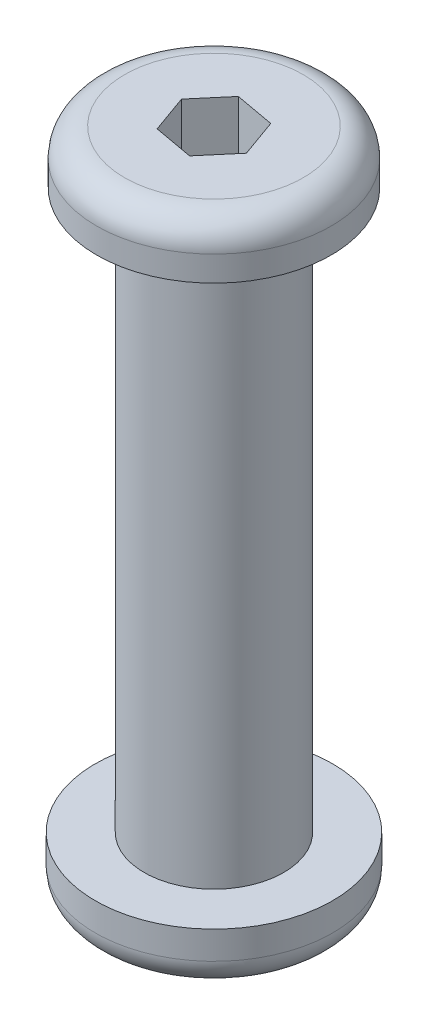
ISO-10303-21;
HEADER;
FILE_DESCRIPTION(('STEP AP214'),'2;1');
FILE_NAME('part.step','',(''),(''),'','','');
FILE_SCHEMA(('AUTOMOTIVE_DESIGN { 1 0 10303 214 1 1 1 1 }'));
ENDSEC;
DATA;
#1=APPLICATION_CONTEXT('core data for automotive mechanical design processes');
#2=APPLICATION_PROTOCOL_DEFINITION('international standard','automotive_design',2000,#1);
#3=PRODUCT_CONTEXT('',#1,'mechanical');
#4=PRODUCT('Part','Part','',(#3));
#5=PRODUCT_RELATED_PRODUCT_CATEGORY('part','',(#4));
#6=PRODUCT_DEFINITION_FORMATION('','',#4);
#7=PRODUCT_DEFINITION_CONTEXT('part definition',#1,'design');
#8=PRODUCT_DEFINITION('design','',#6,#7);
#9=PRODUCT_DEFINITION_SHAPE('','',#8);
#10=(LENGTH_UNIT() NAMED_UNIT(*) SI_UNIT(.MILLI.,.METRE.));
#11=(NAMED_UNIT(*) PLANE_ANGLE_UNIT() SI_UNIT($,.RADIAN.));
#12=(NAMED_UNIT(*) SI_UNIT($,.STERADIAN.) SOLID_ANGLE_UNIT());
#13=UNCERTAINTY_MEASURE_WITH_UNIT(LENGTH_MEASURE(1.E-05),#10,'distance_accuracy_value','');
#14=(GEOMETRIC_REPRESENTATION_CONTEXT(3) GLOBAL_UNCERTAINTY_ASSIGNED_CONTEXT((#13)) GLOBAL_UNIT_ASSIGNED_CONTEXT((#10,
#11,#12)) REPRESENTATION_CONTEXT('',''));
#15=CARTESIAN_POINT('',(0.,0.,0.));
#16=DIRECTION('',(0.,0.,1.));
#17=DIRECTION('',(1.,0.,0.));
#18=AXIS2_PLACEMENT_3D('',#15,#16,#17);
#19=CARTESIAN_POINT('',(0.,20.,0.));
#20=DIRECTION('',(0.,-1.,0.));
#21=DIRECTION('',(0.,0.,-1.));
#22=AXIS2_PLACEMENT_3D('',#19,#20,#21);
#23=CYLINDRICAL_SURFACE('',#22,2.5);
#24=CARTESIAN_POINT('',(0.,20.,0.));
#25=DIRECTION('',(0.,1.,0.));
#26=DIRECTION('',(0.,0.,1.));
#27=AXIS2_PLACEMENT_3D('',#24,#25,#26);
#28=CIRCLE('',#27,2.5);
#29=CARTESIAN_POINT('',(0.,20.,2.5));
#30=VERTEX_POINT('',#29);
#31=EDGE_CURVE('E236',#30,#30,#28,.T.);
#32=ORIENTED_EDGE('',*,*,#31,.F.);
#33=EDGE_LOOP('',(#32));
#34=FACE_BOUND('',#33,.T.);
#35=CARTESIAN_POINT('',(0.,0.,0.));
#36=DIRECTION('',(0.,-1.,0.));
#37=DIRECTION('',(0.,0.,-1.));
#38=AXIS2_PLACEMENT_3D('',#35,#36,#37);
#39=CIRCLE('',#38,2.5);
#40=CARTESIAN_POINT('',(0.,0.,-2.5));
#41=VERTEX_POINT('',#40);
#42=EDGE_CURVE('E188',#41,#41,#39,.T.);
#43=ORIENTED_EDGE('',*,*,#42,.F.);
#44=EDGE_LOOP('',(#43));
#45=FACE_BOUND('',#44,.T.);
#46=ADVANCED_FACE('F41',(#34,#45),#23,.T.);
#47=CARTESIAN_POINT('',(0.,21.9,0.));
#48=DIRECTION('',(0.,1.,0.));
#49=DIRECTION('',(0.,0.,1.));
#50=AXIS2_PLACEMENT_3D('',#47,#48,#49);
#51=PLANE('',#50);
#52=CARTESIAN_POINT('',(0.,21.9,0.));
#53=DIRECTION('',(0.,1.,0.));
#54=DIRECTION('',(0.,0.,1.));
#55=AXIS2_PLACEMENT_3D('',#52,#53,#54);
#56=CIRCLE('',#55,3.2);
#57=CARTESIAN_POINT('',(0.,21.9,3.2));
#58=VERTEX_POINT('',#57);
#59=EDGE_CURVE('E239',#58,#58,#56,.T.);
#60=ORIENTED_EDGE('',*,*,#59,.T.);
#61=EDGE_LOOP('',(#60));
#62=FACE_BOUND('',#61,.T.);
#63=DIRECTION('',(-0.983890145469255,0.,-0.178774107880554));
#64=VECTOR('',#63,1.);
#65=CARTESIAN_POINT('',(0.933529185275309,21.9,-1.10084358270035));
#66=LINE('',#65,#64);
#67=CARTESIAN_POINT('',(0.933529185275309,21.9,-1.10084358270035));
#68=VERTEX_POINT('',#67);
#69=CARTESIAN_POINT('',(-0.486593915573927,21.9,-1.35888178097279));
#70=VERTEX_POINT('',#69);
#71=EDGE_CURVE('E193',#68,#70,#66,.T.);
#72=ORIENTED_EDGE('',*,*,#71,.F.);
#73=DIRECTION('',(-0.337122153771169,0.,-0.941460914449818));
#74=VECTOR('',#73,1.);
#75=CARTESIAN_POINT('',(1.42012310084924,21.9,0.258038198272432));
#76=LINE('',#75,#74);
#77=CARTESIAN_POINT('',(1.42012310084924,21.9,0.258038198272432));
#78=VERTEX_POINT('',#77);
#79=EDGE_CURVE('E191',#78,#68,#76,.T.);
#80=ORIENTED_EDGE('',*,*,#79,.F.);
#81=DIRECTION('',(0.646767991698087,0.,-0.762686806569265));
#82=VECTOR('',#81,1.);
#83=CARTESIAN_POINT('',(0.486593915573928,21.9,1.35888178097278));
#84=LINE('',#83,#82);
#85=CARTESIAN_POINT('',(0.486593915573928,21.9,1.35888178097278));
#86=VERTEX_POINT('',#85);
#87=EDGE_CURVE('E203',#86,#78,#84,.T.);
#88=ORIENTED_EDGE('',*,*,#87,.F.);
#89=DIRECTION('',(0.983890145469255,0.,0.178774107880553));
#90=VECTOR('',#89,1.);
#91=CARTESIAN_POINT('',(-0.933529185275311,21.9,1.10084358270035));
#92=LINE('',#91,#90);
#93=CARTESIAN_POINT('',(-0.933529185275311,21.9,1.10084358270035));
#94=VERTEX_POINT('',#93);
#95=EDGE_CURVE('E200',#94,#86,#92,.T.);
#96=ORIENTED_EDGE('',*,*,#95,.F.);
#97=DIRECTION('',(0.337122153771169,0.,0.941460914449818));
#98=VECTOR('',#97,1.);
#99=CARTESIAN_POINT('',(-1.42012310084924,21.9,-0.258038198272431));
#100=LINE('',#99,#98);
#101=CARTESIAN_POINT('',(-1.42012310084924,21.9,-0.258038198272431));
#102=VERTEX_POINT('',#101);
#103=EDGE_CURVE('E198',#102,#94,#100,.T.);
#104=ORIENTED_EDGE('',*,*,#103,.F.);
#105=DIRECTION('',(-0.646767991698087,0.,0.762686806569266));
#106=VECTOR('',#105,1.);
#107=CARTESIAN_POINT('',(-0.486593915573927,21.9,-1.35888178097279));
#108=LINE('',#107,#106);
#109=EDGE_CURVE('E196',#70,#102,#108,.T.);
#110=ORIENTED_EDGE('',*,*,#109,.F.);
#111=EDGE_LOOP('',(#72,#80,#88,#96,#104,#110));
#112=FACE_BOUND('',#111,.T.);
#113=ADVANCED_FACE('F258',(#62,#112),#51,.T.);
#114=CARTESIAN_POINT('',(0.,20.,0.));
#115=DIRECTION('',(0.,1.,0.));
#116=DIRECTION('',(0.,0.,1.));
#117=AXIS2_PLACEMENT_3D('',#114,#115,#116);
#118=PLANE('',#117);
#119=ORIENTED_EDGE('',*,*,#31,.T.);
#120=EDGE_LOOP('',(#119));
#121=FACE_BOUND('',#120,.T.);
#122=CARTESIAN_POINT('',(0.,20.,0.));
#123=DIRECTION('',(0.,1.,0.));
#124=DIRECTION('',(0.,0.,1.));
#125=AXIS2_PLACEMENT_3D('',#122,#123,#124);
#126=CIRCLE('',#125,4.2);
#127=CARTESIAN_POINT('',(0.,20.,-4.2));
#128=VERTEX_POINT('',#127);
#129=EDGE_CURVE('E233',#128,#128,#126,.T.);
#130=ORIENTED_EDGE('',*,*,#129,.F.);
#131=EDGE_LOOP('',(#130));
#132=FACE_BOUND('',#131,.T.);
#133=ADVANCED_FACE('F265',(#121,#132),#118,.F.);
#134=CARTESIAN_POINT('',(0.,21.9,0.));
#135=DIRECTION('',(0.,-1.,0.));
#136=DIRECTION('',(0.,0.,-1.));
#137=AXIS2_PLACEMENT_3D('',#134,#135,#136);
#138=CYLINDRICAL_SURFACE('',#137,4.2);
#139=CARTESIAN_POINT('',(0.,20.9,0.));
#140=DIRECTION('',(0.,1.,0.));
#141=DIRECTION('',(0.,0.,1.));
#142=AXIS2_PLACEMENT_3D('',#139,#140,#141);
#143=CIRCLE('',#142,4.2);
#144=CARTESIAN_POINT('',(0.,20.9,-4.2));
#145=VERTEX_POINT('',#144);
#146=EDGE_CURVE('E242',#145,#145,#143,.F.);
#147=CARTESIAN_POINT('',(0.,20.9,-4.2));
#148=CARTESIAN_POINT('',(0.,20.890625,-4.2));
#149=CARTESIAN_POINT('',(0.,20.88125,-4.2));
#150=CARTESIAN_POINT('',(0.,20.8625,-4.2));
#151=CARTESIAN_POINT('',(0.,20.853125,-4.2));
#152=CARTESIAN_POINT('',(0.,20.834375,-4.2));
#153=CARTESIAN_POINT('',(0.,20.825,-4.2));
#154=CARTESIAN_POINT('',(0.,20.80625,-4.2));
#155=CARTESIAN_POINT('',(0.,20.796875,-4.2));
#156=CARTESIAN_POINT('',(0.,20.778125,-4.2));
#157=CARTESIAN_POINT('',(0.,20.76875,-4.2));
#158=CARTESIAN_POINT('',(0.,20.75,-4.2));
#159=CARTESIAN_POINT('',(0.,20.740625,-4.2));
#160=CARTESIAN_POINT('',(0.,20.721875,-4.2));
#161=CARTESIAN_POINT('',(0.,20.7125,-4.2));
#162=CARTESIAN_POINT('',(0.,20.69375,-4.2));
#163=CARTESIAN_POINT('',(0.,20.684375,-4.2));
#164=CARTESIAN_POINT('',(0.,20.665625,-4.2));
#165=CARTESIAN_POINT('',(0.,20.65625,-4.2));
#166=CARTESIAN_POINT('',(0.,20.6375,-4.2));
#167=CARTESIAN_POINT('',(0.,20.628125,-4.2));
#168=CARTESIAN_POINT('',(0.,20.609375,-4.2));
#169=CARTESIAN_POINT('',(0.,20.6,-4.2));
#170=CARTESIAN_POINT('',(0.,20.58125,-4.2));
#171=CARTESIAN_POINT('',(0.,20.571875,-4.2));
#172=CARTESIAN_POINT('',(0.,20.553125,-4.2));
#173=CARTESIAN_POINT('',(0.,20.54375,-4.2));
#174=CARTESIAN_POINT('',(0.,20.525,-4.2));
#175=CARTESIAN_POINT('',(0.,20.515625,-4.2));
#176=CARTESIAN_POINT('',(0.,20.496875,-4.2));
#177=CARTESIAN_POINT('',(0.,20.4875,-4.2));
#178=CARTESIAN_POINT('',(0.,20.46875,-4.2));
#179=CARTESIAN_POINT('',(0.,20.459375,-4.2));
#180=CARTESIAN_POINT('',(0.,20.440625,-4.2));
#181=CARTESIAN_POINT('',(0.,20.43125,-4.2));
#182=CARTESIAN_POINT('',(0.,20.4125,-4.2));
#183=CARTESIAN_POINT('',(0.,20.403125,-4.2));
#184=CARTESIAN_POINT('',(0.,20.384375,-4.2));
#185=CARTESIAN_POINT('',(0.,20.375,-4.2));
#186=CARTESIAN_POINT('',(0.,20.35625,-4.2));
#187=CARTESIAN_POINT('',(0.,20.346875,-4.2));
#188=CARTESIAN_POINT('',(0.,20.328125,-4.2));
#189=CARTESIAN_POINT('',(0.,20.31875,-4.2));
#190=CARTESIAN_POINT('',(0.,20.3,-4.2));
#191=CARTESIAN_POINT('',(0.,20.290625,-4.2));
#192=CARTESIAN_POINT('',(0.,20.271875,-4.2));
#193=CARTESIAN_POINT('',(0.,20.2625,-4.2));
#194=CARTESIAN_POINT('',(0.,20.24375,-4.2));
#195=CARTESIAN_POINT('',(0.,20.234375,-4.2));
#196=CARTESIAN_POINT('',(0.,20.215625,-4.2));
#197=CARTESIAN_POINT('',(0.,20.20625,-4.2));
#198=CARTESIAN_POINT('',(0.,20.1875,-4.2));
#199=CARTESIAN_POINT('',(0.,20.178125,-4.2));
#200=CARTESIAN_POINT('',(0.,20.159375,-4.2));
#201=CARTESIAN_POINT('',(0.,20.15,-4.2));
#202=CARTESIAN_POINT('',(0.,20.13125,-4.2));
#203=CARTESIAN_POINT('',(0.,20.121875,-4.2));
#204=CARTESIAN_POINT('',(0.,20.103125,-4.2));
#205=CARTESIAN_POINT('',(0.,20.09375,-4.2));
#206=CARTESIAN_POINT('',(0.,20.075,-4.2));
#207=CARTESIAN_POINT('',(0.,20.065625,-4.2));
#208=CARTESIAN_POINT('',(0.,20.046875,-4.2));
#209=CARTESIAN_POINT('',(0.,20.0375,-4.2));
#210=CARTESIAN_POINT('',(0.,20.01875,-4.2));
#211=CARTESIAN_POINT('',(0.,20.009375,-4.2));
#212=CARTESIAN_POINT('',(0.,20.,-4.2));
#213=B_SPLINE_CURVE_WITH_KNOTS('',3,(#147,#148,#149,#150,#151,#152,#153,#154,#155,#156,#157,
#158,#159,#160,#161,#162,#163,#164,#165,#166,#167,#168,#169,#170,#171,#172,#173,#174,#175,#176,
#177,#178,#179,#180,#181,#182,#183,#184,#185,#186,#187,#188,#189,#190,#191,#192,#193,#194,#195,
#196,#197,#198,#199,#200,#201,#202,#203,#204,#205,#206,#207,#208,#209,#210,#211,#212),
.UNSPECIFIED.,.F.,.F.,(4,2,2,2,2,2,2,2,2,2,2,2,2,2,2,2,2,2,2,2,2,2,2,2,2,2,2,2,2,2,2,2,4),(0.,
0.0281250000000004,0.0562500000000007,0.0843750000000011,0.112500000000001,0.140625000000002,
0.168750000000002,0.196875000000003,0.225,0.253125,0.28125,0.309375000000001,0.337500000000001,
0.365625000000001,0.393750000000002,0.421875000000002,0.449999999999999,0.478124999999999,
0.50625,0.534375,0.5625,0.590625000000001,0.618750000000001,0.646875000000002,0.674999999999998,
0.703124999999999,0.731249999999999,0.759375,0.7875,0.815625,0.843750000000001,
0.871875000000001,0.899999999999998),.UNSPECIFIED.);
#214=EDGE_CURVE('BSEAM279',#145,#128,#213,.T.);
#215=ORIENTED_EDGE('',*,*,#146,.T.);
#216=ORIENTED_EDGE('',*,*,#129,.T.);
#217=ORIENTED_EDGE('',*,*,#214,.T.);
#218=ORIENTED_EDGE('',*,*,#214,.F.);
#219=EDGE_LOOP('',(#215,#217,#216,#218));
#220=FACE_BOUND('',#219,.T.);
#221=ADVANCED_FACE('F279',(#220),#138,.T.);
#222=CARTESIAN_POINT('',(1.42012310084924,21.9,0.258038198272432));
#223=DIRECTION('',(-0.941460914449818,0.,0.337122153771169));
#224=DIRECTION('',(0.337122153771169,0.,0.941460914449819));
#225=AXIS2_PLACEMENT_3D('',#222,#223,#224);
#226=PLANE('',#225);
#227=DIRECTION('',(-0.337122153771169,0.,-0.941460914449818));
#228=VECTOR('',#227,1.);
#229=CARTESIAN_POINT('',(1.42012310084924,20.,0.258038198272432));
#230=LINE('',#229,#228);
#231=CARTESIAN_POINT('',(1.42012310084924,20.,0.258038198272432));
#232=VERTEX_POINT('',#231);
#233=CARTESIAN_POINT('',(0.933529185275309,20.,-1.10084358270035));
#234=VERTEX_POINT('',#233);
#235=EDGE_CURVE('E64',#232,#234,#230,.T.);
#236=ORIENTED_EDGE('',*,*,#235,.F.);
#237=DIRECTION('',(0.,-1.,0.));
#238=VECTOR('',#237,1.);
#239=CARTESIAN_POINT('',(1.42012310084924,21.9,0.258038198272432));
#240=LINE('',#239,#238);
#241=EDGE_CURVE('E205',#78,#232,#240,.T.);
#242=ORIENTED_EDGE('',*,*,#241,.F.);
#243=ORIENTED_EDGE('',*,*,#79,.T.);
#244=DIRECTION('',(0.,-1.,0.));
#245=VECTOR('',#244,1.);
#246=CARTESIAN_POINT('',(0.933529185275309,21.9,-1.10084358270035));
#247=LINE('',#246,#245);
#248=EDGE_CURVE('E230',#68,#234,#247,.T.);
#249=ORIENTED_EDGE('',*,*,#248,.T.);
#250=EDGE_LOOP('',(#236,#242,#243,#249));
#251=FACE_BOUND('',#250,.T.);
#252=ADVANCED_FACE('F282',(#251),#226,.T.);
#253=CARTESIAN_POINT('',(0.933529185275309,21.9,-1.10084358270035));
#254=DIRECTION('',(-0.178774107880554,0.,0.983890145469255));
#255=DIRECTION('',(0.983890145469255,0.,0.178774107880554));
#256=AXIS2_PLACEMENT_3D('',#253,#254,#255);
#257=PLANE('',#256);
#258=DIRECTION('',(-0.983890145469255,0.,-0.178774107880554));
#259=VECTOR('',#258,1.);
#260=CARTESIAN_POINT('',(0.933529185275309,20.,-1.10084358270035));
#261=LINE('',#260,#259);
#262=CARTESIAN_POINT('',(-0.486593915573927,20.,-1.35888178097279));
#263=VERTEX_POINT('',#262);
#264=EDGE_CURVE('E207',#234,#263,#261,.T.);
#265=ORIENTED_EDGE('',*,*,#264,.F.);
#266=ORIENTED_EDGE('',*,*,#248,.F.);
#267=ORIENTED_EDGE('',*,*,#71,.T.);
#268=DIRECTION('',(0.,-1.,0.));
#269=VECTOR('',#268,1.);
#270=CARTESIAN_POINT('',(-0.486593915573927,21.9,-1.35888178097279));
#271=LINE('',#270,#269);
#272=EDGE_CURVE('E227',#70,#263,#271,.T.);
#273=ORIENTED_EDGE('',*,*,#272,.T.);
#274=EDGE_LOOP('',(#265,#266,#267,#273));
#275=FACE_BOUND('',#274,.T.);
#276=ADVANCED_FACE('F288',(#275),#257,.T.);
#277=CARTESIAN_POINT('',(-0.486593915573927,21.9,-1.35888178097279));
#278=DIRECTION('',(0.762686806569265,0.,0.646767991698086));
#279=DIRECTION('',(0.646767991698086,0.,-0.762686806569266));
#280=AXIS2_PLACEMENT_3D('',#277,#278,#279);
#281=PLANE('',#280);
#282=DIRECTION('',(-0.646767991698087,0.,0.762686806569266));
#283=VECTOR('',#282,1.);
#284=CARTESIAN_POINT('',(-0.486593915573927,20.,-1.35888178097279));
#285=LINE('',#284,#283);
#286=CARTESIAN_POINT('',(-1.42012310084924,20.,-0.258038198272431));
#287=VERTEX_POINT('',#286);
#288=EDGE_CURVE('E209',#263,#287,#285,.T.);
#289=ORIENTED_EDGE('',*,*,#288,.F.);
#290=ORIENTED_EDGE('',*,*,#272,.F.);
#291=ORIENTED_EDGE('',*,*,#109,.T.);
#292=DIRECTION('',(0.,-1.,0.));
#293=VECTOR('',#292,1.);
#294=CARTESIAN_POINT('',(-1.42012310084924,21.9,-0.258038198272431));
#295=LINE('',#294,#293);
#296=EDGE_CURVE('E224',#102,#287,#295,.T.);
#297=ORIENTED_EDGE('',*,*,#296,.T.);
#298=EDGE_LOOP('',(#289,#290,#291,#297));
#299=FACE_BOUND('',#298,.T.);
#300=ADVANCED_FACE('F292',(#299),#281,.T.);
#301=CARTESIAN_POINT('',(-1.42012310084924,21.9,-0.258038198272431));
#302=DIRECTION('',(0.941460914449818,0.,-0.337122153771169));
#303=DIRECTION('',(-0.337122153771169,0.,-0.941460914449818));
#304=AXIS2_PLACEMENT_3D('',#301,#302,#303);
#305=PLANE('',#304);
#306=DIRECTION('',(0.337122153771169,0.,0.941460914449818));
#307=VECTOR('',#306,1.);
#308=CARTESIAN_POINT('',(-1.42012310084924,20.,-0.258038198272431));
#309=LINE('',#308,#307);
#310=CARTESIAN_POINT('',(-0.933529185275311,20.,1.10084358270035));
#311=VERTEX_POINT('',#310);
#312=EDGE_CURVE('E211',#287,#311,#309,.T.);
#313=ORIENTED_EDGE('',*,*,#312,.F.);
#314=ORIENTED_EDGE('',*,*,#296,.F.);
#315=ORIENTED_EDGE('',*,*,#103,.T.);
#316=DIRECTION('',(0.,-1.,0.));
#317=VECTOR('',#316,1.);
#318=CARTESIAN_POINT('',(-0.933529185275311,21.9,1.10084358270035));
#319=LINE('',#318,#317);
#320=EDGE_CURVE('E221',#94,#311,#319,.T.);
#321=ORIENTED_EDGE('',*,*,#320,.T.);
#322=EDGE_LOOP('',(#313,#314,#315,#321));
#323=FACE_BOUND('',#322,.T.);
#324=ADVANCED_FACE('F296',(#323),#305,.T.);
#325=CARTESIAN_POINT('',(-0.933529185275311,21.9,1.10084358270035));
#326=DIRECTION('',(0.178774107880553,0.,-0.983890145469255));
#327=DIRECTION('',(-0.983890145469255,0.,-0.178774107880553));
#328=AXIS2_PLACEMENT_3D('',#325,#326,#327);
#329=PLANE('',#328);
#330=DIRECTION('',(0.983890145469255,0.,0.178774107880553));
#331=VECTOR('',#330,1.);
#332=CARTESIAN_POINT('',(-0.933529185275311,20.,1.10084358270035));
#333=LINE('',#332,#331);
#334=CARTESIAN_POINT('',(0.486593915573928,20.,1.35888178097278));
#335=VERTEX_POINT('',#334);
#336=EDGE_CURVE('E213',#311,#335,#333,.T.);
#337=ORIENTED_EDGE('',*,*,#336,.F.);
#338=ORIENTED_EDGE('',*,*,#320,.F.);
#339=ORIENTED_EDGE('',*,*,#95,.T.);
#340=DIRECTION('',(0.,-1.,0.));
#341=VECTOR('',#340,1.);
#342=CARTESIAN_POINT('',(0.486593915573928,21.9,1.35888178097278));
#343=LINE('',#342,#341);
#344=EDGE_CURVE('E218',#86,#335,#343,.T.);
#345=ORIENTED_EDGE('',*,*,#344,.T.);
#346=EDGE_LOOP('',(#337,#338,#339,#345));
#347=FACE_BOUND('',#346,.T.);
#348=ADVANCED_FACE('F300',(#347),#329,.T.);
#349=CARTESIAN_POINT('',(0.486593915573928,21.9,1.35888178097278));
#350=DIRECTION('',(-0.762686806569265,0.,-0.646767991698086));
#351=DIRECTION('',(-0.646767991698087,0.,0.762686806569265));
#352=AXIS2_PLACEMENT_3D('',#349,#350,#351);
#353=PLANE('',#352);
#354=DIRECTION('',(0.646767991698087,0.,-0.762686806569265));
#355=VECTOR('',#354,1.);
#356=CARTESIAN_POINT('',(0.486593915573928,20.,1.35888178097278));
#357=LINE('',#356,#355);
#358=EDGE_CURVE('E194',#335,#232,#357,.T.);
#359=ORIENTED_EDGE('',*,*,#358,.F.);
#360=ORIENTED_EDGE('',*,*,#344,.F.);
#361=ORIENTED_EDGE('',*,*,#87,.T.);
#362=ORIENTED_EDGE('',*,*,#241,.T.);
#363=EDGE_LOOP('',(#359,#360,#361,#362));
#364=FACE_BOUND('',#363,.T.);
#365=ADVANCED_FACE('F278',(#364),#353,.T.);
#366=CARTESIAN_POINT('',(0.,20.,0.));
#367=DIRECTION('',(0.,1.,0.));
#368=DIRECTION('',(0.,0.,1.));
#369=AXIS2_PLACEMENT_3D('',#366,#367,#368);
#370=PLANE('',#369);
#371=ORIENTED_EDGE('',*,*,#235,.T.);
#372=ORIENTED_EDGE('',*,*,#264,.T.);
#373=ORIENTED_EDGE('',*,*,#288,.T.);
#374=ORIENTED_EDGE('',*,*,#312,.T.);
#375=ORIENTED_EDGE('',*,*,#336,.T.);
#376=ORIENTED_EDGE('',*,*,#358,.T.);
#377=EDGE_LOOP('',(#371,#372,#373,#374,#375,#376));
#378=FACE_BOUND('',#377,.T.);
#379=ADVANCED_FACE('F275',(#378),#370,.T.);
#380=CARTESIAN_POINT('',(0.,-2.,0.));
#381=DIRECTION('',(0.,-1.,0.));
#382=DIRECTION('',(0.,0.,-1.));
#383=AXIS2_PLACEMENT_3D('',#380,#381,#382);
#384=PLANE('',#383);
#385=CARTESIAN_POINT('',(0.,-2.,0.));
#386=DIRECTION('',(0.,-1.,0.));
#387=DIRECTION('',(0.,0.,-1.));
#388=AXIS2_PLACEMENT_3D('',#385,#386,#387);
#389=CIRCLE('',#388,3.25);
#390=CARTESIAN_POINT('',(0.,-2.,-3.25));
#391=VERTEX_POINT('',#390);
#392=EDGE_CURVE('E49',#391,#391,#389,.T.);
#393=ORIENTED_EDGE('',*,*,#392,.T.);
#394=EDGE_LOOP('',(#393));
#395=FACE_BOUND('',#394,.T.);
#396=DIRECTION('',(-0.995901214221312,0.,0.0904476175060285));
#397=VECTOR('',#396,1.);
#398=CARTESIAN_POINT('',(0.831789314528723,-2.,1.17960157238331));
#399=LINE('',#398,#397);
#400=CARTESIAN_POINT('',(0.831789314528723,-2.,1.17960157238331));
#401=VERTEX_POINT('',#400);
#402=CARTESIAN_POINT('',(-0.605670270763652,-2.,1.31015146316997));
#403=VERTEX_POINT('',#402);
#404=EDGE_CURVE('E139',#401,#403,#399,.T.);
#405=ORIENTED_EDGE('',*,*,#404,.F.);
#406=DIRECTION('',(-0.419620672638657,0.,0.907699559928439));
#407=VECTOR('',#406,1.);
#408=CARTESIAN_POINT('',(1.43745958529237,-2.,-0.130549890786665));
#409=LINE('',#408,#407);
#410=CARTESIAN_POINT('',(1.43745958529237,-2.,-0.130549890786665));
#411=VERTEX_POINT('',#410);
#412=EDGE_CURVE('E131',#411,#401,#409,.T.);
#413=ORIENTED_EDGE('',*,*,#412,.F.);
#414=DIRECTION('',(0.576280541582655,0.,0.81725194242241));
#415=VECTOR('',#414,1.);
#416=CARTESIAN_POINT('',(0.605670270763651,-2.,-1.31015146316997));
#417=LINE('',#416,#415);
#418=CARTESIAN_POINT('',(0.605670270763652,-2.,-1.31015146316997));
#419=VERTEX_POINT('',#418);
#420=EDGE_CURVE('E162',#419,#411,#417,.T.);
#421=ORIENTED_EDGE('',*,*,#420,.F.);
#422=DIRECTION('',(0.995901214221312,0.,-0.090447617506028));
#423=VECTOR('',#422,1.);
#424=CARTESIAN_POINT('',(-0.831789314528721,-2.,-1.17960157238331));
#425=LINE('',#424,#423);
#426=CARTESIAN_POINT('',(-0.831789314528721,-2.,-1.17960157238331));
#427=VERTEX_POINT('',#426);
#428=EDGE_CURVE('E159',#427,#419,#425,.T.);
#429=ORIENTED_EDGE('',*,*,#428,.F.);
#430=DIRECTION('',(0.419620672638657,0.,-0.907699559928439));
#431=VECTOR('',#430,1.);
#432=CARTESIAN_POINT('',(-1.43745958529237,-2.,0.130549890786665));
#433=LINE('',#432,#431);
#434=CARTESIAN_POINT('',(-1.43745958529237,-2.,0.130549890786665));
#435=VERTEX_POINT('',#434);
#436=EDGE_CURVE('E155',#435,#427,#433,.T.);
#437=ORIENTED_EDGE('',*,*,#436,.F.);
#438=DIRECTION('',(-0.576280541582654,0.,-0.81725194242241));
#439=VECTOR('',#438,1.);
#440=CARTESIAN_POINT('',(-0.605670270763652,-2.,1.31015146316997));
#441=LINE('',#440,#439);
#442=EDGE_CURVE('E153',#403,#435,#441,.T.);
#443=ORIENTED_EDGE('',*,*,#442,.F.);
#444=EDGE_LOOP('',(#405,#413,#421,#429,#437,#443));
#445=FACE_BOUND('',#444,.T.);
#446=ADVANCED_FACE('F151',(#395,#445),#384,.T.);
#447=CARTESIAN_POINT('',(0.,0.,0.));
#448=DIRECTION('',(0.,-1.,0.));
#449=DIRECTION('',(0.,0.,-1.));
#450=AXIS2_PLACEMENT_3D('',#447,#448,#449);
#451=PLANE('',#450);
#452=ORIENTED_EDGE('',*,*,#42,.T.);
#453=EDGE_LOOP('',(#452));
#454=FACE_BOUND('',#453,.T.);
#455=CARTESIAN_POINT('',(0.,0.,0.));
#456=DIRECTION('',(0.,-1.,0.));
#457=DIRECTION('',(0.,0.,-1.));
#458=AXIS2_PLACEMENT_3D('',#455,#456,#457);
#459=CIRCLE('',#458,4.25);
#460=CARTESIAN_POINT('',(0.,0.,-4.25));
#461=VERTEX_POINT('',#460);
#462=EDGE_CURVE('E147',#461,#461,#459,.T.);
#463=ORIENTED_EDGE('',*,*,#462,.F.);
#464=EDGE_LOOP('',(#463));
#465=FACE_BOUND('',#464,.T.);
#466=ADVANCED_FACE('F311',(#454,#465),#451,.F.);
#467=CARTESIAN_POINT('',(0.,-2.,0.));
#468=DIRECTION('',(0.,1.,0.));
#469=DIRECTION('',(0.,0.,1.));
#470=AXIS2_PLACEMENT_3D('',#467,#468,#469);
#471=CYLINDRICAL_SURFACE('',#470,4.25);
#472=CARTESIAN_POINT('',(0.,-1.,0.));
#473=DIRECTION('',(0.,-1.,0.));
#474=DIRECTION('',(0.,0.,-1.));
#475=AXIS2_PLACEMENT_3D('',#472,#473,#474);
#476=CIRCLE('',#475,4.25);
#477=CARTESIAN_POINT('',(0.,-1.,-4.25));
#478=VERTEX_POINT('',#477);
#479=EDGE_CURVE('E11',#478,#478,#476,.F.);
#480=ORIENTED_EDGE('',*,*,#479,.T.);
#481=EDGE_LOOP('',(#480));
#482=FACE_BOUND('',#481,.T.);
#483=ORIENTED_EDGE('',*,*,#462,.T.);
#484=EDGE_LOOP('',(#483));
#485=FACE_BOUND('',#484,.T.);
#486=ADVANCED_FACE('F308',(#482,#485),#471,.T.);
#487=CARTESIAN_POINT('',(1.43745958529237,-2.,-0.130549890786665));
#488=DIRECTION('',(-0.907699559928439,0.,-0.419620672638657));
#489=DIRECTION('',(-0.419620672638657,0.,0.907699559928439));
#490=AXIS2_PLACEMENT_3D('',#487,#488,#489);
#491=PLANE('',#490);
#492=DIRECTION('',(-0.419620672638657,0.,0.907699559928439));
#493=VECTOR('',#492,1.);
#494=CARTESIAN_POINT('',(1.43745958529237,0.,-0.130549890786665));
#495=LINE('',#494,#493);
#496=CARTESIAN_POINT('',(1.43745958529237,0.,-0.130549890786665));
#497=VERTEX_POINT('',#496);
#498=CARTESIAN_POINT('',(0.831789314528723,0.,1.17960157238331));
#499=VERTEX_POINT('',#498);
#500=EDGE_CURVE('E164',#497,#499,#495,.T.);
#501=ORIENTED_EDGE('',*,*,#500,.F.);
#502=DIRECTION('',(0.,1.,0.));
#503=VECTOR('',#502,1.);
#504=CARTESIAN_POINT('',(1.43745958529237,-2.,-0.130549890786665));
#505=LINE('',#504,#503);
#506=EDGE_CURVE('E56',#411,#497,#505,.T.);
#507=ORIENTED_EDGE('',*,*,#506,.F.);
#508=ORIENTED_EDGE('',*,*,#412,.T.);
#509=DIRECTION('',(0.,1.,0.));
#510=VECTOR('',#509,1.);
#511=CARTESIAN_POINT('',(0.831789314528723,-2.,1.17960157238331));
#512=LINE('',#511,#510);
#513=EDGE_CURVE('E134',#401,#499,#512,.T.);
#514=ORIENTED_EDGE('',*,*,#513,.T.);
#515=EDGE_LOOP('',(#501,#507,#508,#514));
#516=FACE_BOUND('',#515,.T.);
#517=ADVANCED_FACE('F133',(#516),#491,.T.);
#518=CARTESIAN_POINT('',(0.831789314528723,-2.,1.17960157238331));
#519=DIRECTION('',(-0.0904476175060285,0.,-0.995901214221312));
#520=DIRECTION('',(-0.995901214221312,0.,0.0904476175060285));
#521=AXIS2_PLACEMENT_3D('',#518,#519,#520);
#522=PLANE('',#521);
#523=DIRECTION('',(-0.995901214221312,0.,0.0904476175060285));
#524=VECTOR('',#523,1.);
#525=CARTESIAN_POINT('',(0.831789314528723,0.,1.17960157238331));
#526=LINE('',#525,#524);
#527=CARTESIAN_POINT('',(-0.605670270763652,0.,1.31015146316997));
#528=VERTEX_POINT('',#527);
#529=EDGE_CURVE('E146',#499,#528,#526,.T.);
#530=ORIENTED_EDGE('',*,*,#529,.F.);
#531=ORIENTED_EDGE('',*,*,#513,.F.);
#532=ORIENTED_EDGE('',*,*,#404,.T.);
#533=DIRECTION('',(0.,1.,0.));
#534=VECTOR('',#533,1.);
#535=CARTESIAN_POINT('',(-0.605670270763652,-2.,1.31015146316997));
#536=LINE('',#535,#534);
#537=EDGE_CURVE('E148',#403,#528,#536,.T.);
#538=ORIENTED_EDGE('',*,*,#537,.T.);
#539=EDGE_LOOP('',(#530,#531,#532,#538));
#540=FACE_BOUND('',#539,.T.);
#541=ADVANCED_FACE('F143',(#540),#522,.T.);
#542=CARTESIAN_POINT('',(-0.605670270763652,-2.,1.31015146316997));
#543=DIRECTION('',(0.81725194242241,0.,-0.576280541582654));
#544=DIRECTION('',(-0.576280541582654,0.,-0.81725194242241));
#545=AXIS2_PLACEMENT_3D('',#542,#543,#544);
#546=PLANE('',#545);
#547=DIRECTION('',(-0.576280541582654,0.,-0.81725194242241));
#548=VECTOR('',#547,1.);
#549=CARTESIAN_POINT('',(-0.605670270763652,0.,1.31015146316997));
#550=LINE('',#549,#548);
#551=CARTESIAN_POINT('',(-1.43745958529237,0.,0.130549890786665));
#552=VERTEX_POINT('',#551);
#553=EDGE_CURVE('E167',#528,#552,#550,.T.);
#554=ORIENTED_EDGE('',*,*,#553,.F.);
#555=ORIENTED_EDGE('',*,*,#537,.F.);
#556=ORIENTED_EDGE('',*,*,#442,.T.);
#557=DIRECTION('',(0.,1.,0.));
#558=VECTOR('',#557,1.);
#559=CARTESIAN_POINT('',(-1.43745958529237,-2.,0.130549890786665));
#560=LINE('',#559,#558);
#561=EDGE_CURVE('E183',#435,#552,#560,.T.);
#562=ORIENTED_EDGE('',*,*,#561,.T.);
#563=EDGE_LOOP('',(#554,#555,#556,#562));
#564=FACE_BOUND('',#563,.T.);
#565=ADVANCED_FACE('F322',(#564),#546,.T.);
#566=CARTESIAN_POINT('',(-1.43745958529237,-2.,0.130549890786665));
#567=DIRECTION('',(0.907699559928438,0.,0.419620672638657));
#568=DIRECTION('',(0.419620672638657,0.,-0.907699559928439));
#569=AXIS2_PLACEMENT_3D('',#566,#567,#568);
#570=PLANE('',#569);
#571=DIRECTION('',(0.419620672638657,0.,-0.907699559928439));
#572=VECTOR('',#571,1.);
#573=CARTESIAN_POINT('',(-1.43745958529237,0.,0.130549890786665));
#574=LINE('',#573,#572);
#575=CARTESIAN_POINT('',(-0.831789314528721,0.,-1.17960157238331));
#576=VERTEX_POINT('',#575);
#577=EDGE_CURVE('E170',#552,#576,#574,.T.);
#578=ORIENTED_EDGE('',*,*,#577,.F.);
#579=ORIENTED_EDGE('',*,*,#561,.F.);
#580=ORIENTED_EDGE('',*,*,#436,.T.);
#581=DIRECTION('',(0.,1.,0.));
#582=VECTOR('',#581,1.);
#583=CARTESIAN_POINT('',(-0.831789314528721,-2.,-1.17960157238331));
#584=LINE('',#583,#582);
#585=EDGE_CURVE('E181',#427,#576,#584,.T.);
#586=ORIENTED_EDGE('',*,*,#585,.T.);
#587=EDGE_LOOP('',(#578,#579,#580,#586));
#588=FACE_BOUND('',#587,.T.);
#589=ADVANCED_FACE('F325',(#588),#570,.T.);
#590=CARTESIAN_POINT('',(-0.831789314528721,-2.,-1.17960157238331));
#591=DIRECTION('',(0.090447617506028,0.,0.995901214221312));
#592=DIRECTION('',(0.995901214221312,0.,-0.090447617506028));
#593=AXIS2_PLACEMENT_3D('',#590,#591,#592);
#594=PLANE('',#593);
#595=DIRECTION('',(0.995901214221312,0.,-0.090447617506028));
#596=VECTOR('',#595,1.);
#597=CARTESIAN_POINT('',(-0.831789314528721,0.,-1.17960157238331));
#598=LINE('',#597,#596);
#599=CARTESIAN_POINT('',(0.605670270763651,0.,-1.31015146316997));
#600=VERTEX_POINT('',#599);
#601=EDGE_CURVE('E173',#576,#600,#598,.T.);
#602=ORIENTED_EDGE('',*,*,#601,.F.);
#603=ORIENTED_EDGE('',*,*,#585,.F.);
#604=ORIENTED_EDGE('',*,*,#428,.T.);
#605=DIRECTION('',(0.,1.,0.));
#606=VECTOR('',#605,1.);
#607=CARTESIAN_POINT('',(0.605670270763651,-2.,-1.31015146316997));
#608=LINE('',#607,#606);
#609=EDGE_CURVE('E179',#419,#600,#608,.T.);
#610=ORIENTED_EDGE('',*,*,#609,.T.);
#611=EDGE_LOOP('',(#602,#603,#604,#610));
#612=FACE_BOUND('',#611,.T.);
#613=ADVANCED_FACE('F329',(#612),#594,.T.);
#614=CARTESIAN_POINT('',(0.605670270763651,-2.,-1.31015146316997));
#615=DIRECTION('',(-0.81725194242241,0.,0.576280541582655));
#616=DIRECTION('',(0.576280541582655,0.,0.81725194242241));
#617=AXIS2_PLACEMENT_3D('',#614,#615,#616);
#618=PLANE('',#617);
#619=DIRECTION('',(0.576280541582655,0.,0.81725194242241));
#620=VECTOR('',#619,1.);
#621=CARTESIAN_POINT('',(0.605670270763651,0.,-1.31015146316997));
#622=LINE('',#621,#620);
#623=EDGE_CURVE('E140',#600,#497,#622,.T.);
#624=ORIENTED_EDGE('',*,*,#623,.F.);
#625=ORIENTED_EDGE('',*,*,#609,.F.);
#626=ORIENTED_EDGE('',*,*,#420,.T.);
#627=ORIENTED_EDGE('',*,*,#506,.T.);
#628=EDGE_LOOP('',(#624,#625,#626,#627));
#629=FACE_BOUND('',#628,.T.);
#630=ADVANCED_FACE('F273',(#629),#618,.T.);
#631=CARTESIAN_POINT('',(0.,0.,0.));
#632=DIRECTION('',(0.,1.,0.));
#633=DIRECTION('',(0.,0.,1.));
#634=AXIS2_PLACEMENT_3D('',#631,#632,#633);
#635=PLANE('',#634);
#636=ORIENTED_EDGE('',*,*,#623,.T.);
#637=ORIENTED_EDGE('',*,*,#500,.T.);
#638=ORIENTED_EDGE('',*,*,#529,.T.);
#639=ORIENTED_EDGE('',*,*,#553,.T.);
#640=ORIENTED_EDGE('',*,*,#577,.T.);
#641=ORIENTED_EDGE('',*,*,#601,.T.);
#642=EDGE_LOOP('',(#636,#637,#638,#639,#640,#641));
#643=FACE_BOUND('',#642,.T.);
#644=ADVANCED_FACE('F254',(#643),#635,.F.);
#645=CARTESIAN_POINT('',(0.,20.9,0.));
#646=DIRECTION('',(0.,1.,0.));
#647=DIRECTION('',(0.,0.,1.));
#648=AXIS2_PLACEMENT_3D('',#645,#646,#647);
#649=TOROIDAL_SURFACE('',#648,3.2,1.);
#650=ORIENTED_EDGE('',*,*,#146,.F.);
#651=EDGE_LOOP('',(#650));
#652=FACE_BOUND('',#651,.T.);
#653=ORIENTED_EDGE('',*,*,#59,.F.);
#654=EDGE_LOOP('',(#653));
#655=FACE_BOUND('',#654,.T.);
#656=ADVANCED_FACE('F249',(#652,#655),#649,.T.);
#657=CARTESIAN_POINT('',(0.,-1.,0.));
#658=DIRECTION('',(0.,-1.,0.));
#659=DIRECTION('',(0.,0.,-1.));
#660=AXIS2_PLACEMENT_3D('',#657,#658,#659);
#661=TOROIDAL_SURFACE('',#660,3.25,1.);
#662=ORIENTED_EDGE('',*,*,#479,.F.);
#663=EDGE_LOOP('',(#662));
#664=FACE_BOUND('',#663,.T.);
#665=ORIENTED_EDGE('',*,*,#392,.F.);
#666=EDGE_LOOP('',(#665));
#667=FACE_BOUND('',#666,.T.);
#668=ADVANCED_FACE('F43',(#664,#667),#661,.T.);
#669=CLOSED_SHELL('',(#46,#113,#133,#221,#252,#276,#300,#324,#348,#365,#379,#446,#466,#486,#517,
#541,#565,#589,#613,#630,#644,#656,#668));
#670=MANIFOLD_SOLID_BREP('B2',#669);
#671=ADVANCED_BREP_SHAPE_REPRESENTATION('',(#18,#670),#14);
#672=SHAPE_DEFINITION_REPRESENTATION(#9,#671);
ENDSEC;
END-ISO-10303-21;
